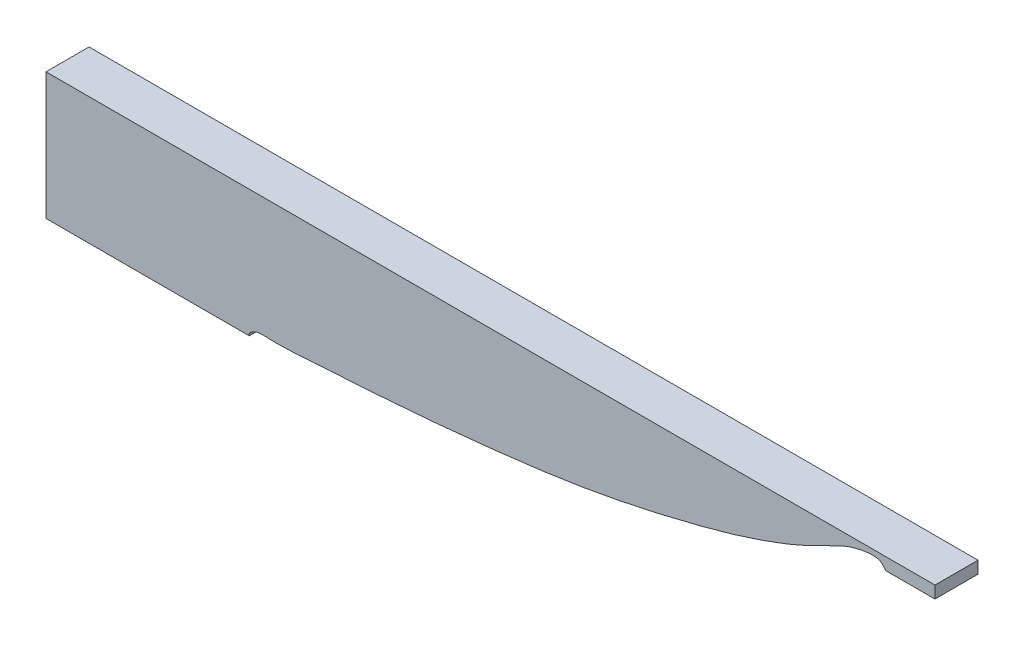
ISO-10303-21;
HEADER;
FILE_DESCRIPTION(('STEP AP214'),'2;1');
FILE_NAME('part.step','',(''),(''),'','','');
FILE_SCHEMA(('AUTOMOTIVE_DESIGN { 1 0 10303 214 1 1 1 1 }'));
ENDSEC;
DATA;
#1=APPLICATION_CONTEXT('core data for automotive mechanical design processes');
#2=APPLICATION_PROTOCOL_DEFINITION('international standard','automotive_design',2000,#1);
#3=PRODUCT_CONTEXT('',#1,'mechanical');
#4=PRODUCT('Part','Part','',(#3));
#5=PRODUCT_RELATED_PRODUCT_CATEGORY('part','',(#4));
#6=PRODUCT_DEFINITION_FORMATION('','',#4);
#7=PRODUCT_DEFINITION_CONTEXT('part definition',#1,'design');
#8=PRODUCT_DEFINITION('design','',#6,#7);
#9=PRODUCT_DEFINITION_SHAPE('','',#8);
#10=(LENGTH_UNIT() NAMED_UNIT(*) SI_UNIT(.MILLI.,.METRE.));
#11=(NAMED_UNIT(*) PLANE_ANGLE_UNIT() SI_UNIT($,.RADIAN.));
#12=(NAMED_UNIT(*) SI_UNIT($,.STERADIAN.) SOLID_ANGLE_UNIT());
#13=UNCERTAINTY_MEASURE_WITH_UNIT(LENGTH_MEASURE(1.E-05),#10,'distance_accuracy_value','');
#14=(GEOMETRIC_REPRESENTATION_CONTEXT(3) GLOBAL_UNCERTAINTY_ASSIGNED_CONTEXT((#13)) GLOBAL_UNIT_ASSIGNED_CONTEXT((#10,
#11,#12)) REPRESENTATION_CONTEXT('',''));
#15=CARTESIAN_POINT('',(0.,0.,0.));
#16=DIRECTION('',(0.,0.,1.));
#17=DIRECTION('',(1.,0.,0.));
#18=AXIS2_PLACEMENT_3D('',#15,#16,#17);
#19=CARTESIAN_POINT('',(-54.1677919113564,-21.3434716350608,396.));
#20=CARTESIAN_POINT('',(-54.1807788185499,-21.2629148346231,396.));
#21=CARTESIAN_POINT('',(-54.192068551947,-21.1802926789239,396.));
#22=CARTESIAN_POINT('',(-54.1784908549704,-21.0168323632681,396.));
#23=CARTESIAN_POINT('',(-54.1542172602304,-20.9359795389721,396.));
#24=CARTESIAN_POINT('',(-54.0713492437284,-20.7942591126695,396.));
#25=CARTESIAN_POINT('',(-54.0115509394841,-20.7369868128218,396.));
#26=CARTESIAN_POINT('',(-53.8863473266642,-20.6369611808226,396.));
#27=CARTESIAN_POINT('',(-53.8219367150551,-20.5891828526201,396.));
#28=CARTESIAN_POINT('',(-53.6283320528865,-20.4463084362076,396.));
#29=CARTESIAN_POINT('',(-53.4941452799769,-20.3566287255717,396.));
#30=CARTESIAN_POINT('',(-53.2148830804543,-20.1998943337417,396.));
#31=CARTESIAN_POINT('',(-53.0664440062266,-20.1344575850364,396.));
#32=CARTESIAN_POINT('',(-52.608884016302,-19.9899434313446,396.));
#33=CARTESIAN_POINT('',(-52.2948748173376,-19.953721044232,396.));
#34=CARTESIAN_POINT('',(-51.66056771,-19.9234293463732,396.));
#35=CARTESIAN_POINT('',(-51.3410916241751,-19.9293208183092,396.));
#36=CARTESIAN_POINT('',(-50.7048547900397,-19.9552395463827,396.));
#37=CARTESIAN_POINT('',(-50.3869473437789,-19.9750939821911,396.));
#38=CARTESIAN_POINT('',(-49.7507164059674,-20.0012054173797,396.));
#39=CARTESIAN_POINT('',(-49.4324086299022,-20.0082982574731,396.));
#40=CARTESIAN_POINT('',(-48.4770969677394,-20.0149329301553,396.));
#41=CARTESIAN_POINT('',(-47.841287837113,-19.9988732313416,396.));
#42=CARTESIAN_POINT('',(-46.5708856823499,-19.9433716596187,396.));
#43=CARTESIAN_POINT('',(-45.9361477210478,-19.9067165048653,396.));
#44=CARTESIAN_POINT('',(-44.6667042168853,-19.8327828834587,396.));
#45=CARTESIAN_POINT('',(-44.0319764855472,-19.7959310363915,396.));
#46=CARTESIAN_POINT('',(-42.127976810993,-19.6818469522523,396.));
#47=CARTESIAN_POINT('',(-40.8588757984976,-19.6013282169107,396.));
#48=CARTESIAN_POINT('',(-34.513578568938,-19.1947385205474,396.));
#49=CARTESIAN_POINT('',(-29.4372859849224,-18.8647417270583,396.));
#50=CARTESIAN_POINT('',(-19.2967526516414,-18.0533502764765,396.));
#51=CARTESIAN_POINT('',(-14.2335408272937,-17.5609860473856,396.));
#52=CARTESIAN_POINT('',(-6.65209993848173,-16.7145109842843,396.));
#53=CARTESIAN_POINT('',(-4.12672399701935,-16.4165355655145,396.));
#54=CARTESIAN_POINT('',(0.918294621862348,-15.7693807149846,396.));
#55=CARTESIAN_POINT('',(3.43772835447702,-15.4181644745275,396.));
#56=CARTESIAN_POINT('',(8.46187683762121,-14.6273304064959,396.));
#57=CARTESIAN_POINT('',(10.9674874531568,-14.1864674520554,396.));
#58=CARTESIAN_POINT('',(15.9603391192423,-13.2158527997377,396.));
#59=CARTESIAN_POINT('',(18.4483920698118,-12.6885181200156,396.));
#60=CARTESIAN_POINT('',(23.4113908425132,-11.5725383394942,396.));
#61=CARTESIAN_POINT('',(25.8851508022233,-10.9826036401359,396.));
#62=CARTESIAN_POINT('',(30.8137922248534,-9.72481245160042,396.));
#63=CARTESIAN_POINT('',(33.2690020413051,-9.06004663797376,396.));
#64=CARTESIAN_POINT('',(36.9204896632276,-7.97607522824274,396.));
#65=CARTESIAN_POINT('',(38.1324950634521,-7.59958916667461,396.));
#66=CARTESIAN_POINT('',(40.5430242933331,-6.80698053200878,396.));
#67=CARTESIAN_POINT('',(41.7413120834534,-6.39016399052246,396.));
#68=CARTESIAN_POINT('',(44.1243336436156,-5.51668139073002,396.));
#69=CARTESIAN_POINT('',(45.3094686656402,-5.06119503391011,396.));
#70=CARTESIAN_POINT('',(47.661531095797,-4.0966909980603,396.));
#71=CARTESIAN_POINT('',(48.829232506922,-3.58673496963155,396.));
#72=CARTESIAN_POINT('',(50.5566542052991,-2.76302836132132,396.));
#73=CARTESIAN_POINT('',(51.1282332116274,-2.47877224902269,396.));
#74=CARTESIAN_POINT('',(52.2668073233688,-1.89975789976491,396.));
#75=CARTESIAN_POINT('',(52.8331970848543,-1.60361276603191,396.));
#76=CARTESIAN_POINT('',(54.535411495803,-0.72215402044128,396.));
#77=CARTESIAN_POINT('',(55.6758735604354,-0.147465139159774,396.));
#78=CARTESIAN_POINT('',(57.4706979039561,0.521816014747955,396.));
#79=CARTESIAN_POINT('',(58.083719904946,0.711122540590532,396.));
#80=CARTESIAN_POINT('',(59.0269023207162,0.940899417992586,396.));
#81=CARTESIAN_POINT('',(59.3461550994089,1.00888847858055,396.));
#82=CARTESIAN_POINT('',(59.9856331646846,1.1239593887153,396.));
#83=CARTESIAN_POINT('',(60.306325225271,1.1709135107308,396.));
#84=CARTESIAN_POINT('',(60.9498348768953,1.24122229406313,396.));
#85=CARTESIAN_POINT('',(61.2725943671297,1.26522204029334,396.));
#86=CARTESIAN_POINT('',(61.7599615169587,1.26538258671492,396.));
#87=CARTESIAN_POINT('',(61.9229469029157,1.25955525915559,396.));
#88=CARTESIAN_POINT('',(62.2501762797698,1.23392649334048,396.));
#89=CARTESIAN_POINT('',(62.412685108452,1.21365248403726,396.));
#90=CARTESIAN_POINT('',(62.7317026903428,1.14630044801615,396.));
#91=CARTESIAN_POINT('',(62.8908208988887,1.09776290661012,396.));
#92=CARTESIAN_POINT('',(63.1858133356026,0.955470077639355,396.));
#93=CARTESIAN_POINT('',(63.3177386083416,0.859450617595087,396.));
#94=CARTESIAN_POINT('',(63.5633333558118,0.639482502540357,396.));
#95=CARTESIAN_POINT('',(63.6736395415668,0.517571194364462,396.));
#96=CARTESIAN_POINT('',(63.8447621311955,0.340111862652886,396.));
#97=CARTESIAN_POINT('',(63.9020892283637,0.281232063489866,396.));
#98=CARTESIAN_POINT('',(64.0050973683338,0.152352193039855,396.));
#99=CARTESIAN_POINT('',(64.0480215017097,0.0808826914529333,396.));
#100=CARTESIAN_POINT('',(64.0671879602649,0.,396.));
#101=B_SPLINE_CURVE_WITH_KNOTS('',3,(#19,#20,#21,#22,#23,#24,#25,#26,#27,#28,#29,#30,#31,#32,
#33,#34,#35,#36,#37,#38,#39,#40,#41,#42,#43,#44,#45,#46,#47,#48,#49,#50,#51,#52,#53,#54,#55,#56,
#57,#58,#59,#60,#61,#62,#63,#64,#65,#66,#67,#68,#69,#70,#71,#72,#73,#74,#75,#76,#77,#78,#79,#80,
#81,#82,#83,#84,#85,#86,#87,#88,#89,#90,#91,#92,#93,#94,#95,#96,#97,#98,#99,#100),.UNSPECIFIED.,
.F.,.F.,(4,2,2,2,2,2,2,2,2,2,2,2,2,2,2,2,2,2,2,2,2,2,2,2,2,2,2,2,2,2,2,2,2,2,2,2,2,2,2,2,4),(0.,
0.001953125,0.00390625000000011,0.00585937500000011,0.00781250000000022,0.0117187500000002,
0.0156250000000002,0.0234375000000001,0.03125,0.0390624999999999,0.0468749999999997,
0.0624999999999996,0.0781249999999994,0.0937499999999993,0.124999999999999,0.249999999999999,
0.374999999999999,0.437499999999999,0.499999999999999,0.562499999999999,0.624999999999999,
0.687499999999999,0.749999999999999,0.781249999999999,0.812499999999999,0.843749999999999,
0.874999999999999,0.890624999999999,0.90625,0.9375,0.953125,0.9609375,0.96875,0.9765625,
0.98046875,0.984375,0.98828125,0.9921875,0.99609375,0.998046875,1.),.UNSPECIFIED.);
#102=DIRECTION('',(0.,0.,-1.));
#103=VECTOR('',#102,1.);
#104=SURFACE_OF_LINEAR_EXTRUSION('',#101,#103);
#105=CARTESIAN_POINT('',(-54.1677919113564,-21.3434716350608,388.000000000001));
#106=CARTESIAN_POINT('',(-54.1807788185499,-21.2629148346231,388.000000000001));
#107=CARTESIAN_POINT('',(-54.192068551947,-21.1802926789239,388.000000000001));
#108=CARTESIAN_POINT('',(-54.1784908549704,-21.0168323632681,388.000000000001));
#109=CARTESIAN_POINT('',(-54.1542172602304,-20.9359795389721,388.000000000001));
#110=CARTESIAN_POINT('',(-54.0713492437284,-20.7942591126695,388.000000000001));
#111=CARTESIAN_POINT('',(-54.0115509394841,-20.7369868128218,388.000000000001));
#112=CARTESIAN_POINT('',(-53.8863473266642,-20.6369611808226,388.000000000001));
#113=CARTESIAN_POINT('',(-53.8219367150551,-20.5891828526201,388.000000000001));
#114=CARTESIAN_POINT('',(-53.6283320528865,-20.4463084362076,388.000000000001));
#115=CARTESIAN_POINT('',(-53.4941452799769,-20.3566287255717,388.000000000001));
#116=CARTESIAN_POINT('',(-53.2148830804543,-20.1998943337417,388.000000000001));
#117=CARTESIAN_POINT('',(-53.0664440062266,-20.1344575850364,388.000000000001));
#118=CARTESIAN_POINT('',(-52.608884016302,-19.9899434313446,388.000000000001));
#119=CARTESIAN_POINT('',(-52.2948748173376,-19.953721044232,388.000000000001));
#120=CARTESIAN_POINT('',(-51.66056771,-19.9234293463732,388.000000000001));
#121=CARTESIAN_POINT('',(-51.3410916241751,-19.9293208183092,388.000000000001));
#122=CARTESIAN_POINT('',(-50.7048547900397,-19.9552395463827,388.000000000001));
#123=CARTESIAN_POINT('',(-50.3869473437789,-19.9750939821911,388.000000000001));
#124=CARTESIAN_POINT('',(-49.7507164059674,-20.0012054173797,388.000000000001));
#125=CARTESIAN_POINT('',(-49.4324086299022,-20.0082982574731,388.000000000001));
#126=CARTESIAN_POINT('',(-48.4770969677394,-20.0149329301553,388.000000000001));
#127=CARTESIAN_POINT('',(-47.841287837113,-19.9988732313416,388.000000000001));
#128=CARTESIAN_POINT('',(-46.5708856823499,-19.9433716596187,388.000000000001));
#129=CARTESIAN_POINT('',(-45.9361477210478,-19.9067165048653,388.000000000001));
#130=CARTESIAN_POINT('',(-44.6667042168853,-19.8327828834587,388.000000000001));
#131=CARTESIAN_POINT('',(-44.0319764855472,-19.7959310363915,388.000000000001));
#132=CARTESIAN_POINT('',(-42.127976810993,-19.6818469522523,388.000000000001));
#133=CARTESIAN_POINT('',(-40.8588757984976,-19.6013282169107,388.000000000001));
#134=CARTESIAN_POINT('',(-34.513578568938,-19.1947385205474,388.000000000001));
#135=CARTESIAN_POINT('',(-29.4372859849224,-18.8647417270583,388.000000000001));
#136=CARTESIAN_POINT('',(-19.2967526516414,-18.0533502764765,388.000000000001));
#137=CARTESIAN_POINT('',(-14.2335408272937,-17.5609860473856,388.000000000001));
#138=CARTESIAN_POINT('',(-6.65209993848173,-16.7145109842843,388.000000000001));
#139=CARTESIAN_POINT('',(-4.12672399701935,-16.4165355655145,388.000000000001));
#140=CARTESIAN_POINT('',(0.918294621862348,-15.7693807149846,388.000000000001));
#141=CARTESIAN_POINT('',(3.43772835447702,-15.4181644745275,388.000000000001));
#142=CARTESIAN_POINT('',(8.46187683762121,-14.6273304064959,388.000000000001));
#143=CARTESIAN_POINT('',(10.9674874531568,-14.1864674520554,388.000000000001));
#144=CARTESIAN_POINT('',(15.9603391192423,-13.2158527997377,388.000000000001));
#145=CARTESIAN_POINT('',(18.4483920698118,-12.6885181200156,388.000000000001));
#146=CARTESIAN_POINT('',(23.4113908425132,-11.5725383394942,388.000000000001));
#147=CARTESIAN_POINT('',(25.8851508022233,-10.9826036401359,388.000000000001));
#148=CARTESIAN_POINT('',(30.8137922248534,-9.72481245160042,388.000000000001));
#149=CARTESIAN_POINT('',(33.2690020413051,-9.06004663797376,388.000000000001));
#150=CARTESIAN_POINT('',(36.9204896632276,-7.97607522824274,388.000000000001));
#151=CARTESIAN_POINT('',(38.1324950634521,-7.59958916667461,388.000000000001));
#152=CARTESIAN_POINT('',(40.5430242933331,-6.80698053200878,388.000000000001));
#153=CARTESIAN_POINT('',(41.7413120834534,-6.39016399052246,388.000000000001));
#154=CARTESIAN_POINT('',(44.1243336436156,-5.51668139073002,388.000000000001));
#155=CARTESIAN_POINT('',(45.3094686656402,-5.06119503391011,388.000000000001));
#156=CARTESIAN_POINT('',(47.661531095797,-4.0966909980603,388.000000000001));
#157=CARTESIAN_POINT('',(48.829232506922,-3.58673496963155,388.000000000001));
#158=CARTESIAN_POINT('',(50.5566542052991,-2.76302836132132,388.000000000001));
#159=CARTESIAN_POINT('',(51.1282332116274,-2.47877224902269,388.000000000001));
#160=CARTESIAN_POINT('',(52.2668073233688,-1.89975789976491,388.000000000001));
#161=CARTESIAN_POINT('',(52.8331970848543,-1.60361276603191,388.000000000001));
#162=CARTESIAN_POINT('',(54.535411495803,-0.72215402044128,388.000000000001));
#163=CARTESIAN_POINT('',(55.6758735604354,-0.147465139159774,388.000000000001));
#164=CARTESIAN_POINT('',(57.4706979039561,0.521816014747955,388.000000000001));
#165=CARTESIAN_POINT('',(58.083719904946,0.711122540590532,388.000000000001));
#166=CARTESIAN_POINT('',(59.0269023207162,0.940899417992586,388.000000000001));
#167=CARTESIAN_POINT('',(59.3461550994089,1.00888847858055,388.000000000001));
#168=CARTESIAN_POINT('',(59.9856331646846,1.1239593887153,388.000000000001));
#169=CARTESIAN_POINT('',(60.306325225271,1.1709135107308,388.000000000001));
#170=CARTESIAN_POINT('',(60.9498348768953,1.24122229406313,388.000000000001));
#171=CARTESIAN_POINT('',(61.2725943671297,1.26522204029334,388.000000000001));
#172=CARTESIAN_POINT('',(61.7599615169587,1.26538258671492,388.000000000001));
#173=CARTESIAN_POINT('',(61.9229469029157,1.25955525915559,388.000000000001));
#174=CARTESIAN_POINT('',(62.2501762797698,1.23392649334048,388.000000000001));
#175=CARTESIAN_POINT('',(62.412685108452,1.21365248403726,388.000000000001));
#176=CARTESIAN_POINT('',(62.7317026903428,1.14630044801615,388.000000000001));
#177=CARTESIAN_POINT('',(62.8908208988887,1.09776290661012,388.000000000001));
#178=CARTESIAN_POINT('',(63.1858133356026,0.955470077639355,388.000000000001));
#179=CARTESIAN_POINT('',(63.3177386083416,0.859450617595087,388.000000000001));
#180=CARTESIAN_POINT('',(63.5633333558118,0.639482502540357,388.000000000001));
#181=CARTESIAN_POINT('',(63.6736395415668,0.517571194364462,388.000000000001));
#182=CARTESIAN_POINT('',(63.8447621311955,0.340111862652886,388.000000000001));
#183=CARTESIAN_POINT('',(63.9020892283637,0.281232063489866,388.000000000001));
#184=CARTESIAN_POINT('',(64.0050973683338,0.152352193039855,388.000000000001));
#185=CARTESIAN_POINT('',(64.0480215017097,0.0808826914529333,388.000000000001));
#186=CARTESIAN_POINT('',(64.0671879602649,0.,388.000000000001));
#187=B_SPLINE_CURVE_WITH_KNOTS('',3,(#105,#106,#107,#108,#109,#110,#111,#112,#113,#114,#115,
#116,#117,#118,#119,#120,#121,#122,#123,#124,#125,#126,#127,#128,#129,#130,#131,#132,#133,#134,
#135,#136,#137,#138,#139,#140,#141,#142,#143,#144,#145,#146,#147,#148,#149,#150,#151,#152,#153,
#154,#155,#156,#157,#158,#159,#160,#161,#162,#163,#164,#165,#166,#167,#168,#169,#170,#171,#172,
#173,#174,#175,#176,#177,#178,#179,#180,#181,#182,#183,#184,#185,#186),.UNSPECIFIED.,.F.,.F.,(4,
2,2,2,2,2,2,2,2,2,2,2,2,2,2,2,2,2,2,2,2,2,2,2,2,2,2,2,2,2,2,2,2,2,2,2,2,2,2,2,4),(0.,
0.001953125,0.00390625000000011,0.00585937500000011,0.00781250000000022,0.0117187500000002,
0.0156250000000002,0.0234375000000001,0.03125,0.0390624999999999,0.0468749999999997,
0.0624999999999996,0.0781249999999994,0.0937499999999993,0.124999999999999,0.249999999999999,
0.374999999999999,0.437499999999999,0.499999999999999,0.562499999999999,0.624999999999999,
0.687499999999999,0.749999999999999,0.781249999999999,0.812499999999999,0.843749999999999,
0.874999999999999,0.890624999999999,0.90625,0.9375,0.953125,0.9609375,0.96875,0.9765625,
0.98046875,0.984375,0.98828125,0.9921875,0.99609375,0.998046875,1.),.UNSPECIFIED.);
#188=CARTESIAN_POINT('',(-54.1677919113564,-21.3434716350608,388.));
#189=VERTEX_POINT('',#188);
#190=CARTESIAN_POINT('',(64.0671879602649,-1.11254389490063E-13,388.));
#191=VERTEX_POINT('',#190);
#192=EDGE_CURVE('E208',#189,#191,#187,.T.);
#193=ORIENTED_EDGE('',*,*,#192,.T.);
#194=DIRECTION('',(0.,0.,-1.));
#195=VECTOR('',#194,1.);
#196=CARTESIAN_POINT('',(64.0671879602649,-1.11254389490063E-13,396.));
#197=LINE('',#196,#195);
#198=CARTESIAN_POINT('',(64.0671879602649,-1.11254389490063E-13,396.));
#199=VERTEX_POINT('',#198);
#200=EDGE_CURVE('E11',#199,#191,#197,.T.);
#201=ORIENTED_EDGE('',*,*,#200,.F.);
#202=CARTESIAN_POINT('',(64.0671879602649,0.,396.));
#203=CARTESIAN_POINT('',(64.0480215017097,0.0808826914529333,396.));
#204=CARTESIAN_POINT('',(64.0050973683338,0.152352193039855,396.));
#205=CARTESIAN_POINT('',(63.9020892283637,0.281232063489866,396.));
#206=CARTESIAN_POINT('',(63.8447621311955,0.340111862652886,396.));
#207=CARTESIAN_POINT('',(63.6736395415668,0.517571194364462,396.));
#208=CARTESIAN_POINT('',(63.5633333558118,0.639482502540357,396.));
#209=CARTESIAN_POINT('',(63.3177386083416,0.859450617595087,396.));
#210=CARTESIAN_POINT('',(63.1858133356026,0.955470077639355,396.));
#211=CARTESIAN_POINT('',(62.8908208988887,1.09776290661012,396.));
#212=CARTESIAN_POINT('',(62.7317026903428,1.14630044801615,396.));
#213=CARTESIAN_POINT('',(62.412685108452,1.21365248403726,396.));
#214=CARTESIAN_POINT('',(62.2501762797698,1.23392649334048,396.));
#215=CARTESIAN_POINT('',(61.9229469029157,1.25955525915559,396.));
#216=CARTESIAN_POINT('',(61.7599615169587,1.26538258671492,396.));
#217=CARTESIAN_POINT('',(61.2725943671297,1.26522204029334,396.));
#218=CARTESIAN_POINT('',(60.9498348768953,1.24122229406313,396.));
#219=CARTESIAN_POINT('',(60.306325225271,1.1709135107308,396.));
#220=CARTESIAN_POINT('',(59.9856331646846,1.1239593887153,396.));
#221=CARTESIAN_POINT('',(59.3461550994089,1.00888847858055,396.));
#222=CARTESIAN_POINT('',(59.0269023207162,0.940899417992586,396.));
#223=CARTESIAN_POINT('',(58.083719904946,0.711122540590532,396.));
#224=CARTESIAN_POINT('',(57.4706979039561,0.521816014747955,396.));
#225=CARTESIAN_POINT('',(55.6758735604354,-0.147465139159774,396.));
#226=CARTESIAN_POINT('',(54.535411495803,-0.72215402044128,396.));
#227=CARTESIAN_POINT('',(52.8331970848543,-1.60361276603191,396.));
#228=CARTESIAN_POINT('',(52.2668073233688,-1.89975789976491,396.));
#229=CARTESIAN_POINT('',(51.1282332116274,-2.47877224902269,396.));
#230=CARTESIAN_POINT('',(50.5566542052991,-2.76302836132132,396.));
#231=CARTESIAN_POINT('',(48.829232506922,-3.58673496963155,396.));
#232=CARTESIAN_POINT('',(47.661531095797,-4.0966909980603,396.));
#233=CARTESIAN_POINT('',(45.3094686656402,-5.06119503391011,396.));
#234=CARTESIAN_POINT('',(44.1243336436156,-5.51668139073002,396.));
#235=CARTESIAN_POINT('',(41.7413120834534,-6.39016399052246,396.));
#236=CARTESIAN_POINT('',(40.5430242933331,-6.80698053200878,396.));
#237=CARTESIAN_POINT('',(38.1324950634521,-7.59958916667461,396.));
#238=CARTESIAN_POINT('',(36.9204896632276,-7.97607522824274,396.));
#239=CARTESIAN_POINT('',(33.2690020413051,-9.06004663797376,396.));
#240=CARTESIAN_POINT('',(30.8137922248534,-9.72481245160042,396.));
#241=CARTESIAN_POINT('',(25.8851508022233,-10.9826036401359,396.));
#242=CARTESIAN_POINT('',(23.4113908425132,-11.5725383394942,396.));
#243=CARTESIAN_POINT('',(18.4483920698118,-12.6885181200156,396.));
#244=CARTESIAN_POINT('',(15.9603391192423,-13.2158527997377,396.));
#245=CARTESIAN_POINT('',(10.9674874531568,-14.1864674520554,396.));
#246=CARTESIAN_POINT('',(8.46187683762121,-14.6273304064959,396.));
#247=CARTESIAN_POINT('',(3.43772835447702,-15.4181644745275,396.));
#248=CARTESIAN_POINT('',(0.918294621862348,-15.7693807149846,396.));
#249=CARTESIAN_POINT('',(-4.12672399701935,-16.4165355655145,396.));
#250=CARTESIAN_POINT('',(-6.65209993848173,-16.7145109842843,396.));
#251=CARTESIAN_POINT('',(-14.2335408272937,-17.5609860473856,396.));
#252=CARTESIAN_POINT('',(-19.2967526516414,-18.0533502764765,396.));
#253=CARTESIAN_POINT('',(-29.4372859849224,-18.8647417270583,396.));
#254=CARTESIAN_POINT('',(-34.513578568938,-19.1947385205474,396.));
#255=CARTESIAN_POINT('',(-40.8588757984976,-19.6013282169107,396.));
#256=CARTESIAN_POINT('',(-42.127976810993,-19.6818469522523,396.));
#257=CARTESIAN_POINT('',(-44.0319764855472,-19.7959310363915,396.));
#258=CARTESIAN_POINT('',(-44.6667042168853,-19.8327828834587,396.));
#259=CARTESIAN_POINT('',(-45.9361477210478,-19.9067165048653,396.));
#260=CARTESIAN_POINT('',(-46.5708856823499,-19.9433716596187,396.));
#261=CARTESIAN_POINT('',(-47.841287837113,-19.9988732313416,396.));
#262=CARTESIAN_POINT('',(-48.4770969677394,-20.0149329301553,396.));
#263=CARTESIAN_POINT('',(-49.4324086299022,-20.0082982574731,396.));
#264=CARTESIAN_POINT('',(-49.7507164059674,-20.0012054173797,396.));
#265=CARTESIAN_POINT('',(-50.3869473437789,-19.9750939821911,396.));
#266=CARTESIAN_POINT('',(-50.7048547900397,-19.9552395463827,396.));
#267=CARTESIAN_POINT('',(-51.3410916241751,-19.9293208183092,396.));
#268=CARTESIAN_POINT('',(-51.66056771,-19.9234293463732,396.));
#269=CARTESIAN_POINT('',(-52.2948748173376,-19.953721044232,396.));
#270=CARTESIAN_POINT('',(-52.608884016302,-19.9899434313446,396.));
#271=CARTESIAN_POINT('',(-53.0664440062266,-20.1344575850364,396.));
#272=CARTESIAN_POINT('',(-53.2148830804543,-20.1998943337417,396.));
#273=CARTESIAN_POINT('',(-53.4941452799769,-20.3566287255717,396.));
#274=CARTESIAN_POINT('',(-53.6283320528865,-20.4463084362076,396.));
#275=CARTESIAN_POINT('',(-53.8219367150551,-20.5891828526201,396.));
#276=CARTESIAN_POINT('',(-53.8863473266642,-20.6369611808226,396.));
#277=CARTESIAN_POINT('',(-54.0115509394841,-20.7369868128218,396.));
#278=CARTESIAN_POINT('',(-54.0713492437284,-20.7942591126695,396.));
#279=CARTESIAN_POINT('',(-54.1542172602304,-20.9359795389721,396.));
#280=CARTESIAN_POINT('',(-54.1784908549704,-21.0168323632681,396.));
#281=CARTESIAN_POINT('',(-54.192068551947,-21.1802926789239,396.));
#282=CARTESIAN_POINT('',(-54.1807788185499,-21.2629148346231,396.));
#283=CARTESIAN_POINT('',(-54.1677919113564,-21.3434716350608,396.));
#284=B_SPLINE_CURVE_WITH_KNOTS('',3,(#202,#203,#204,#205,#206,#207,#208,#209,#210,#211,#212,
#213,#214,#215,#216,#217,#218,#219,#220,#221,#222,#223,#224,#225,#226,#227,#228,#229,#230,#231,
#232,#233,#234,#235,#236,#237,#238,#239,#240,#241,#242,#243,#244,#245,#246,#247,#248,#249,#250,
#251,#252,#253,#254,#255,#256,#257,#258,#259,#260,#261,#262,#263,#264,#265,#266,#267,#268,#269,
#270,#271,#272,#273,#274,#275,#276,#277,#278,#279,#280,#281,#282,#283),.UNSPECIFIED.,.F.,.F.,(4,
2,2,2,2,2,2,2,2,2,2,2,2,2,2,2,2,2,2,2,2,2,2,2,2,2,2,2,2,2,2,2,2,2,2,2,2,2,2,2,4),(0.,
0.001953125,0.00390625000000011,0.0078125,0.0117187499999999,0.0156249999999998,
0.0195312499999998,0.0234374999999998,0.0312499999999999,0.0390625,0.046875,0.0625000000000002,
0.0937500000000004,0.109375000000001,0.125000000000001,0.156250000000001,0.187500000000001,
0.218750000000001,0.250000000000001,0.312500000000001,0.375000000000001,0.437500000000001,
0.500000000000001,0.562500000000001,0.625000000000001,0.750000000000001,0.875000000000001,
0.906250000000001,0.921875000000001,0.9375,0.953125,0.9609375,0.96875,0.9765625,0.984375,
0.98828125,0.9921875,0.994140625,0.99609375,0.998046875,1.),.UNSPECIFIED.);
#285=CARTESIAN_POINT('',(-54.1677919113564,-21.3434716350608,396.));
#286=VERTEX_POINT('',#285);
#287=EDGE_CURVE('E191',#286,#199,#284,.F.);
#288=ORIENTED_EDGE('',*,*,#287,.F.);
#289=DIRECTION('',(0.,0.,-1.));
#290=VECTOR('',#289,1.);
#291=CARTESIAN_POINT('',(-54.1677919113564,-21.3434716350608,396.));
#292=LINE('',#291,#290);
#293=EDGE_CURVE('E116',#286,#189,#292,.T.);
#294=ORIENTED_EDGE('',*,*,#293,.T.);
#295=EDGE_LOOP('',(#193,#201,#288,#294));
#296=FACE_BOUND('',#295,.T.);
#297=ADVANCED_FACE('F30',(#296),#104,.F.);
#298=CARTESIAN_POINT('',(64.0671879602649,-1.11254389490063E-13,396.));
#299=DIRECTION('',(0.,1.,0.));
#300=DIRECTION('',(-1.,0.,0.));
#301=AXIS2_PLACEMENT_3D('',#298,#299,#300);
#302=PLANE('',#301);
#303=DIRECTION('',(1.,0.,0.));
#304=VECTOR('',#303,1.);
#305=CARTESIAN_POINT('',(64.0671879602649,-1.11254389490063E-13,388.));
#306=LINE('',#305,#304);
#307=CARTESIAN_POINT('',(73.219683935787,0.,388.));
#308=VERTEX_POINT('',#307);
#309=EDGE_CURVE('E161',#191,#308,#306,.T.);
#310=ORIENTED_EDGE('',*,*,#309,.T.);
#311=DIRECTION('',(0.,0.,-1.));
#312=VECTOR('',#311,1.);
#313=CARTESIAN_POINT('',(73.219683935787,0.,396.));
#314=LINE('',#313,#312);
#315=CARTESIAN_POINT('',(73.219683935787,0.,396.));
#316=VERTEX_POINT('',#315);
#317=EDGE_CURVE('E41',#316,#308,#314,.T.);
#318=ORIENTED_EDGE('',*,*,#317,.F.);
#319=DIRECTION('',(1.,0.,0.));
#320=VECTOR('',#319,1.);
#321=CARTESIAN_POINT('',(64.0671879602649,-1.11254389490063E-13,396.));
#322=LINE('',#321,#320);
#323=EDGE_CURVE('E89',#199,#316,#322,.T.);
#324=ORIENTED_EDGE('',*,*,#323,.F.);
#325=ORIENTED_EDGE('',*,*,#200,.T.);
#326=EDGE_LOOP('',(#310,#318,#324,#325));
#327=FACE_BOUND('',#326,.T.);
#328=ADVANCED_FACE('F226',(#327),#302,.F.);
#329=CARTESIAN_POINT('',(73.219683935787,2.25600000000005,396.));
#330=DIRECTION('',(-1.,0.,0.));
#331=DIRECTION('',(0.,0.,1.));
#332=AXIS2_PLACEMENT_3D('',#329,#330,#331);
#333=PLANE('',#332);
#334=DIRECTION('',(0.,1.,0.));
#335=VECTOR('',#334,1.);
#336=CARTESIAN_POINT('',(73.219683935787,2.25600000000005,388.));
#337=LINE('',#336,#335);
#338=CARTESIAN_POINT('',(73.219683935787,2.25600000000005,388.));
#339=VERTEX_POINT('',#338);
#340=EDGE_CURVE('E156',#308,#339,#337,.T.);
#341=ORIENTED_EDGE('',*,*,#340,.T.);
#342=DIRECTION('',(0.,0.,-1.));
#343=VECTOR('',#342,1.);
#344=CARTESIAN_POINT('',(73.219683935787,2.25600000000005,396.));
#345=LINE('',#344,#343);
#346=CARTESIAN_POINT('',(73.219683935787,2.25600000000005,396.));
#347=VERTEX_POINT('',#346);
#348=EDGE_CURVE('E111',#347,#339,#345,.T.);
#349=ORIENTED_EDGE('',*,*,#348,.F.);
#350=DIRECTION('',(0.,1.,0.));
#351=VECTOR('',#350,1.);
#352=CARTESIAN_POINT('',(73.219683935787,2.25600000000005,396.));
#353=LINE('',#352,#351);
#354=EDGE_CURVE('E102',#316,#347,#353,.T.);
#355=ORIENTED_EDGE('',*,*,#354,.F.);
#356=ORIENTED_EDGE('',*,*,#317,.T.);
#357=EDGE_LOOP('',(#341,#349,#355,#356));
#358=FACE_BOUND('',#357,.T.);
#359=ADVANCED_FACE('F229',(#358),#333,.F.);
#360=CARTESIAN_POINT('',(73.219683935787,2.25600000000005,396.));
#361=DIRECTION('',(0.,-1.,0.));
#362=DIRECTION('',(1.,0.,0.));
#363=AXIS2_PLACEMENT_3D('',#360,#361,#362);
#364=PLANE('',#363);
#365=DIRECTION('',(-1.,0.,0.));
#366=VECTOR('',#365,1.);
#367=CARTESIAN_POINT('',(73.219683935787,2.25600000000005,388.));
#368=LINE('',#367,#366);
#369=CARTESIAN_POINT('',(-91.935308330414,2.25600000000003,388.));
#370=VERTEX_POINT('',#369);
#371=EDGE_CURVE('E110',#339,#370,#368,.T.);
#372=ORIENTED_EDGE('',*,*,#371,.T.);
#373=DIRECTION('',(0.,0.,-1.));
#374=VECTOR('',#373,1.);
#375=CARTESIAN_POINT('',(-91.935308330414,2.25600000000003,396.));
#376=LINE('',#375,#374);
#377=CARTESIAN_POINT('',(-91.935308330414,2.25600000000003,396.));
#378=VERTEX_POINT('',#377);
#379=EDGE_CURVE('E107',#378,#370,#376,.T.);
#380=ORIENTED_EDGE('',*,*,#379,.F.);
#381=DIRECTION('',(-1.,0.,0.));
#382=VECTOR('',#381,1.);
#383=CARTESIAN_POINT('',(73.219683935787,2.25600000000005,396.));
#384=LINE('',#383,#382);
#385=EDGE_CURVE('E96',#347,#378,#384,.T.);
#386=ORIENTED_EDGE('',*,*,#385,.F.);
#387=ORIENTED_EDGE('',*,*,#348,.T.);
#388=EDGE_LOOP('',(#372,#380,#386,#387));
#389=FACE_BOUND('',#388,.T.);
#390=ADVANCED_FACE('F108',(#389),#364,.F.);
#391=CARTESIAN_POINT('',(-91.9353083304097,-21.3435770779705,396.));
#392=DIRECTION('',(1.,1.79944032690115E-13,0.));
#393=DIRECTION('',(-1.79944032690115E-13,1.,0.));
#394=AXIS2_PLACEMENT_3D('',#391,#392,#393);
#395=PLANE('',#394);
#396=DIRECTION('',(1.79944032690115E-13,-1.,0.));
#397=VECTOR('',#396,1.);
#398=CARTESIAN_POINT('',(-91.9353083304097,-21.3435770779705,388.));
#399=LINE('',#398,#397);
#400=CARTESIAN_POINT('',(-91.9353083304097,-21.3435770779705,388.));
#401=VERTEX_POINT('',#400);
#402=EDGE_CURVE('E74',#370,#401,#399,.T.);
#403=ORIENTED_EDGE('',*,*,#402,.T.);
#404=DIRECTION('',(0.,0.,-1.));
#405=VECTOR('',#404,1.);
#406=CARTESIAN_POINT('',(-91.9353083304097,-21.3435770779705,396.));
#407=LINE('',#406,#405);
#408=CARTESIAN_POINT('',(-91.9353083304097,-21.3435770779705,396.));
#409=VERTEX_POINT('',#408);
#410=EDGE_CURVE('E112',#409,#401,#407,.T.);
#411=ORIENTED_EDGE('',*,*,#410,.F.);
#412=DIRECTION('',(1.79944032690115E-13,-1.,0.));
#413=VECTOR('',#412,1.);
#414=CARTESIAN_POINT('',(-91.9353083304097,-21.3435770779705,396.));
#415=LINE('',#414,#413);
#416=EDGE_CURVE('E100',#378,#409,#415,.T.);
#417=ORIENTED_EDGE('',*,*,#416,.F.);
#418=ORIENTED_EDGE('',*,*,#379,.T.);
#419=EDGE_LOOP('',(#403,#411,#417,#418));
#420=FACE_BOUND('',#419,.T.);
#421=ADVANCED_FACE('F114',(#420),#395,.F.);
#422=CARTESIAN_POINT('',(-91.9353083304139,-21.3435770779757,396.));
#423=CARTESIAN_POINT('',(-79.3461361906959,-21.3435564576415,396.));
#424=CARTESIAN_POINT('',(-66.7569640509875,-21.3435227488201,396.));
#425=CARTESIAN_POINT('',(-54.1677919113564,-21.3434716350608,396.));
#426=B_SPLINE_CURVE_WITH_KNOTS('',3,(#422,#423,#424,#425),.UNSPECIFIED.,.F.,.F.,(4,4),(0.,1.),.UNSPECIFIED.);
#427=DIRECTION('',(0.,0.,-1.));
#428=VECTOR('',#427,1.);
#429=SURFACE_OF_LINEAR_EXTRUSION('',#426,#428);
#430=CARTESIAN_POINT('',(-91.9353083304139,-21.3435770779757,388.));
#431=CARTESIAN_POINT('',(-79.3461361906959,-21.3435564576415,388.));
#432=CARTESIAN_POINT('',(-66.7569640509875,-21.3435227488201,388.));
#433=CARTESIAN_POINT('',(-54.1677919113564,-21.3434716350608,388.));
#434=B_SPLINE_CURVE_WITH_KNOTS('',3,(#430,#431,#432,#433),.UNSPECIFIED.,.F.,.F.,(4,4),(0.,1.),.UNSPECIFIED.);
#435=EDGE_CURVE('E80',#401,#189,#434,.T.);
#436=ORIENTED_EDGE('',*,*,#435,.T.);
#437=ORIENTED_EDGE('',*,*,#293,.F.);
#438=CARTESIAN_POINT('',(-54.1677919113564,-21.3434716350608,396.));
#439=CARTESIAN_POINT('',(-66.7569640509875,-21.3435227488201,396.));
#440=CARTESIAN_POINT('',(-79.3461361906959,-21.3435564576415,396.));
#441=CARTESIAN_POINT('',(-91.9353083304139,-21.3435770779757,396.));
#442=B_SPLINE_CURVE_WITH_KNOTS('',3,(#438,#439,#440,#441),.UNSPECIFIED.,.F.,.F.,(4,4),(0.,1.),.UNSPECIFIED.);
#443=EDGE_CURVE('E50',#409,#286,#442,.F.);
#444=ORIENTED_EDGE('',*,*,#443,.F.);
#445=ORIENTED_EDGE('',*,*,#410,.T.);
#446=EDGE_LOOP('',(#436,#437,#444,#445));
#447=FACE_BOUND('',#446,.T.);
#448=ADVANCED_FACE('F135',(#447),#429,.F.);
#449=CARTESIAN_POINT('',(5.94980259604925,-15.0227474405116,396.));
#450=DIRECTION('',(0.,0.,-1.));
#451=DIRECTION('',(-1.,0.,0.));
#452=AXIS2_PLACEMENT_3D('',#449,#450,#451);
#453=PLANE('',#452);
#454=ORIENTED_EDGE('',*,*,#287,.T.);
#455=ORIENTED_EDGE('',*,*,#323,.T.);
#456=ORIENTED_EDGE('',*,*,#354,.T.);
#457=ORIENTED_EDGE('',*,*,#385,.T.);
#458=ORIENTED_EDGE('',*,*,#416,.T.);
#459=ORIENTED_EDGE('',*,*,#443,.T.);
#460=EDGE_LOOP('',(#454,#455,#456,#457,#458,#459));
#461=FACE_BOUND('',#460,.T.);
#462=ADVANCED_FACE('F98',(#461),#453,.F.);
#463=CARTESIAN_POINT('',(5.94980259604925,-15.0227474405116,388.));
#464=DIRECTION('',(0.,0.,-1.));
#465=DIRECTION('',(-1.,0.,0.));
#466=AXIS2_PLACEMENT_3D('',#463,#464,#465);
#467=PLANE('',#466);
#468=ORIENTED_EDGE('',*,*,#192,.F.);
#469=ORIENTED_EDGE('',*,*,#435,.F.);
#470=ORIENTED_EDGE('',*,*,#402,.F.);
#471=ORIENTED_EDGE('',*,*,#371,.F.);
#472=ORIENTED_EDGE('',*,*,#340,.F.);
#473=ORIENTED_EDGE('',*,*,#309,.F.);
#474=EDGE_LOOP('',(#468,#469,#470,#471,#472,#473));
#475=FACE_BOUND('',#474,.T.);
#476=ADVANCED_FACE('F146',(#475),#467,.T.);
#477=CLOSED_SHELL('',(#297,#328,#359,#390,#421,#448,#462,#476));
#478=MANIFOLD_SOLID_BREP('B2',#477);
#479=ADVANCED_BREP_SHAPE_REPRESENTATION('',(#18,#478),#14);
#480=SHAPE_DEFINITION_REPRESENTATION(#9,#479);
ENDSEC;
END-ISO-10303-21;
